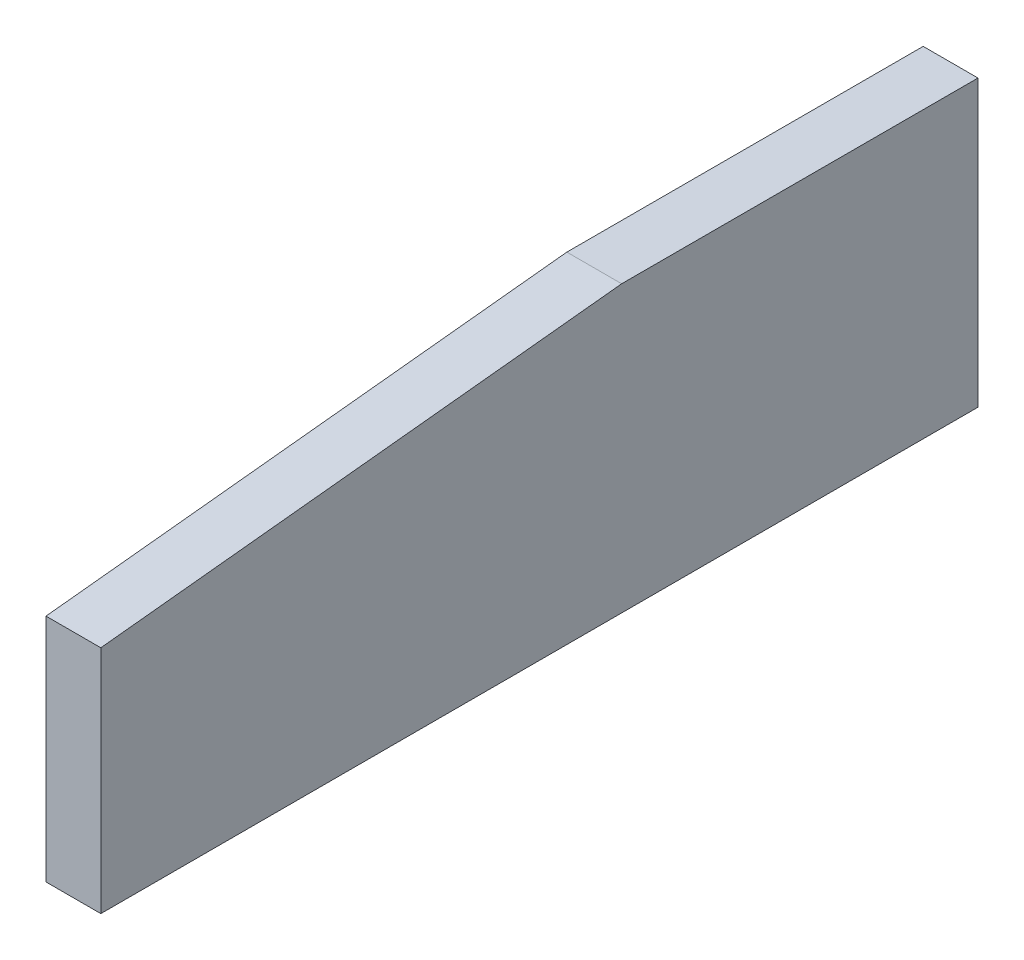
ISO-10303-21;
HEADER;
FILE_DESCRIPTION(('STEP AP214'),'2;1');
FILE_NAME('part.step','',(''),(''),'','','');
FILE_SCHEMA(('AUTOMOTIVE_DESIGN { 1 0 10303 214 1 1 1 1 }'));
ENDSEC;
DATA;
#1=APPLICATION_CONTEXT('core data for automotive mechanical design processes');
#2=APPLICATION_PROTOCOL_DEFINITION('international standard','automotive_design',2000,#1);
#3=PRODUCT_CONTEXT('',#1,'mechanical');
#4=PRODUCT('Part','Part','',(#3));
#5=PRODUCT_RELATED_PRODUCT_CATEGORY('part','',(#4));
#6=PRODUCT_DEFINITION_FORMATION('','',#4);
#7=PRODUCT_DEFINITION_CONTEXT('part definition',#1,'design');
#8=PRODUCT_DEFINITION('design','',#6,#7);
#9=PRODUCT_DEFINITION_SHAPE('','',#8);
#10=(LENGTH_UNIT() NAMED_UNIT(*) SI_UNIT(.MILLI.,.METRE.));
#11=(NAMED_UNIT(*) PLANE_ANGLE_UNIT() SI_UNIT($,.RADIAN.));
#12=(NAMED_UNIT(*) SI_UNIT($,.STERADIAN.) SOLID_ANGLE_UNIT());
#13=UNCERTAINTY_MEASURE_WITH_UNIT(LENGTH_MEASURE(1.E-05),#10,'distance_accuracy_value','');
#14=(GEOMETRIC_REPRESENTATION_CONTEXT(3) GLOBAL_UNCERTAINTY_ASSIGNED_CONTEXT((#13)) GLOBAL_UNIT_ASSIGNED_CONTEXT((#10,
#11,#12)) REPRESENTATION_CONTEXT('',''));
#15=CARTESIAN_POINT('',(0.,0.,0.));
#16=DIRECTION('',(0.,0.,1.));
#17=DIRECTION('',(1.,0.,0.));
#18=AXIS2_PLACEMENT_3D('',#15,#16,#17);
#19=CARTESIAN_POINT('',(10.,35.1320754716981,11.3396226415094));
#20=DIRECTION('',(0.,-0.994505452921406,-0.104684784518043));
#21=DIRECTION('',(0.,0.104684784518043,-0.994505452921406));
#22=AXIS2_PLACEMENT_3D('',#19,#20,#21);
#23=PLANE('',#22);
#24=DIRECTION('',(0.,-0.104684784518043,0.994505452921406));
#25=VECTOR('',#24,1.);
#26=CARTESIAN_POINT('',(0.,35.1320754716981,11.3396226415094));
#27=LINE('',#26,#25);
#28=CARTESIAN_POINT('',(0.,35.1320754716981,11.3396226415094));
#29=VERTEX_POINT('',#28);
#30=CARTESIAN_POINT('',(0.,25.1320754716981,106.339622641509));
#31=VERTEX_POINT('',#30);
#32=EDGE_CURVE('E110',#29,#31,#27,.T.);
#33=ORIENTED_EDGE('',*,*,#32,.T.);
#34=DIRECTION('',(-1.,0.,0.));
#35=VECTOR('',#34,1.);
#36=CARTESIAN_POINT('',(10.,25.1320754716981,106.339622641509));
#37=LINE('',#36,#35);
#38=CARTESIAN_POINT('',(10.,25.1320754716981,106.339622641509));
#39=VERTEX_POINT('',#38);
#40=EDGE_CURVE('E11',#39,#31,#37,.T.);
#41=ORIENTED_EDGE('',*,*,#40,.F.);
#42=DIRECTION('',(0.,-0.104684784518043,0.994505452921406));
#43=VECTOR('',#42,1.);
#44=CARTESIAN_POINT('',(10.,35.1320754716981,11.3396226415094));
#45=LINE('',#44,#43);
#46=CARTESIAN_POINT('',(10.,35.1320754716981,11.3396226415094));
#47=VERTEX_POINT('',#46);
#48=EDGE_CURVE('E119',#47,#39,#45,.T.);
#49=ORIENTED_EDGE('',*,*,#48,.F.);
#50=DIRECTION('',(-1.,0.,0.));
#51=VECTOR('',#50,1.);
#52=CARTESIAN_POINT('',(10.,35.1320754716981,11.3396226415094));
#53=LINE('',#52,#51);
#54=EDGE_CURVE('E106',#47,#29,#53,.T.);
#55=ORIENTED_EDGE('',*,*,#54,.T.);
#56=EDGE_LOOP('',(#33,#41,#49,#55));
#57=FACE_BOUND('',#56,.T.);
#58=ADVANCED_FACE('F36',(#57),#23,.F.);
#59=CARTESIAN_POINT('',(10.,25.1320754716981,106.339622641509));
#60=DIRECTION('',(0.,0.,-1.));
#61=DIRECTION('',(0.,1.,0.));
#62=AXIS2_PLACEMENT_3D('',#59,#60,#61);
#63=PLANE('',#62);
#64=DIRECTION('',(0.,-1.,0.));
#65=VECTOR('',#64,1.);
#66=CARTESIAN_POINT('',(0.,25.1320754716981,106.339622641509));
#67=LINE('',#66,#65);
#68=CARTESIAN_POINT('',(0.,-16.8679245283019,106.339622641509));
#69=VERTEX_POINT('',#68);
#70=EDGE_CURVE('E113',#31,#69,#67,.T.);
#71=ORIENTED_EDGE('',*,*,#70,.T.);
#72=DIRECTION('',(-1.,0.,0.));
#73=VECTOR('',#72,1.);
#74=CARTESIAN_POINT('',(10.,-16.8679245283019,106.339622641509));
#75=LINE('',#74,#73);
#76=CARTESIAN_POINT('',(10.,-16.8679245283019,106.339622641509));
#77=VERTEX_POINT('',#76);
#78=EDGE_CURVE('E44',#77,#69,#75,.T.);
#79=ORIENTED_EDGE('',*,*,#78,.F.);
#80=DIRECTION('',(0.,-1.,0.));
#81=VECTOR('',#80,1.);
#82=CARTESIAN_POINT('',(10.,25.1320754716981,106.339622641509));
#83=LINE('',#82,#81);
#84=EDGE_CURVE('E86',#39,#77,#83,.T.);
#85=ORIENTED_EDGE('',*,*,#84,.F.);
#86=ORIENTED_EDGE('',*,*,#40,.T.);
#87=EDGE_LOOP('',(#71,#79,#85,#86));
#88=FACE_BOUND('',#87,.T.);
#89=ADVANCED_FACE('F138',(#88),#63,.F.);
#90=CARTESIAN_POINT('',(10.,-16.8679245283019,106.339622641509));
#91=DIRECTION('',(0.,1.,0.));
#92=DIRECTION('',(0.,0.,1.));
#93=AXIS2_PLACEMENT_3D('',#90,#91,#92);
#94=PLANE('',#93);
#95=DIRECTION('',(0.,0.,-1.));
#96=VECTOR('',#95,1.);
#97=CARTESIAN_POINT('',(0.,-16.8679245283019,106.339622641509));
#98=LINE('',#97,#96);
#99=CARTESIAN_POINT('',(0.,-16.8679245283019,-53.6603773584906));
#100=VERTEX_POINT('',#99);
#101=EDGE_CURVE('E101',#69,#100,#98,.T.);
#102=ORIENTED_EDGE('',*,*,#101,.T.);
#103=DIRECTION('',(-1.,0.,0.));
#104=VECTOR('',#103,1.);
#105=CARTESIAN_POINT('',(10.,-16.8679245283019,-53.6603773584906));
#106=LINE('',#105,#104);
#107=CARTESIAN_POINT('',(10.,-16.8679245283019,-53.6603773584906));
#108=VERTEX_POINT('',#107);
#109=EDGE_CURVE('E98',#108,#100,#106,.T.);
#110=ORIENTED_EDGE('',*,*,#109,.F.);
#111=DIRECTION('',(0.,0.,-1.));
#112=VECTOR('',#111,1.);
#113=CARTESIAN_POINT('',(10.,-16.8679245283019,106.339622641509));
#114=LINE('',#113,#112);
#115=EDGE_CURVE('E90',#77,#108,#114,.T.);
#116=ORIENTED_EDGE('',*,*,#115,.F.);
#117=ORIENTED_EDGE('',*,*,#78,.T.);
#118=EDGE_LOOP('',(#102,#110,#116,#117));
#119=FACE_BOUND('',#118,.T.);
#120=ADVANCED_FACE('F99',(#119),#94,.F.);
#121=CARTESIAN_POINT('',(10.,-16.8679245283019,-53.6603773584906));
#122=DIRECTION('',(0.,0.,1.));
#123=DIRECTION('',(1.,0.,0.));
#124=AXIS2_PLACEMENT_3D('',#121,#122,#123);
#125=PLANE('',#124);
#126=DIRECTION('',(0.,1.,0.));
#127=VECTOR('',#126,1.);
#128=CARTESIAN_POINT('',(0.,-16.8679245283019,-53.6603773584906));
#129=LINE('',#128,#127);
#130=CARTESIAN_POINT('',(0.,35.1320754716981,-53.6603773584906));
#131=VERTEX_POINT('',#130);
#132=EDGE_CURVE('E72',#100,#131,#129,.T.);
#133=ORIENTED_EDGE('',*,*,#132,.T.);
#134=DIRECTION('',(-1.,0.,0.));
#135=VECTOR('',#134,1.);
#136=CARTESIAN_POINT('',(10.,35.1320754716981,-53.6603773584906));
#137=LINE('',#136,#135);
#138=CARTESIAN_POINT('',(10.,35.1320754716981,-53.6603773584906));
#139=VERTEX_POINT('',#138);
#140=EDGE_CURVE('E102',#139,#131,#137,.T.);
#141=ORIENTED_EDGE('',*,*,#140,.F.);
#142=DIRECTION('',(0.,1.,0.));
#143=VECTOR('',#142,1.);
#144=CARTESIAN_POINT('',(10.,-16.8679245283019,-53.6603773584906));
#145=LINE('',#144,#143);
#146=EDGE_CURVE('E94',#108,#139,#145,.T.);
#147=ORIENTED_EDGE('',*,*,#146,.F.);
#148=ORIENTED_EDGE('',*,*,#109,.T.);
#149=EDGE_LOOP('',(#133,#141,#147,#148));
#150=FACE_BOUND('',#149,.T.);
#151=ADVANCED_FACE('F104',(#150),#125,.F.);
#152=CARTESIAN_POINT('',(10.,35.1320754716981,-53.6603773584906));
#153=DIRECTION('',(0.,-1.,0.));
#154=DIRECTION('',(0.,0.,-1.));
#155=AXIS2_PLACEMENT_3D('',#152,#153,#154);
#156=PLANE('',#155);
#157=DIRECTION('',(0.,0.,1.));
#158=VECTOR('',#157,1.);
#159=CARTESIAN_POINT('',(0.,35.1320754716981,-53.6603773584906));
#160=LINE('',#159,#158);
#161=EDGE_CURVE('E78',#131,#29,#160,.T.);
#162=ORIENTED_EDGE('',*,*,#161,.T.);
#163=ORIENTED_EDGE('',*,*,#54,.F.);
#164=DIRECTION('',(0.,0.,1.));
#165=VECTOR('',#164,1.);
#166=CARTESIAN_POINT('',(10.,35.1320754716981,-53.6603773584906));
#167=LINE('',#166,#165);
#168=EDGE_CURVE('E52',#139,#47,#167,.T.);
#169=ORIENTED_EDGE('',*,*,#168,.F.);
#170=ORIENTED_EDGE('',*,*,#140,.T.);
#171=EDGE_LOOP('',(#162,#163,#169,#170));
#172=FACE_BOUND('',#171,.T.);
#173=ADVANCED_FACE('F127',(#172),#156,.F.);
#174=CARTESIAN_POINT('',(10.,0.,0.));
#175=DIRECTION('',(1.,0.,0.));
#176=DIRECTION('',(0.,0.,-1.));
#177=AXIS2_PLACEMENT_3D('',#174,#175,#176);
#178=PLANE('',#177);
#179=ORIENTED_EDGE('',*,*,#48,.T.);
#180=ORIENTED_EDGE('',*,*,#84,.T.);
#181=ORIENTED_EDGE('',*,*,#115,.T.);
#182=ORIENTED_EDGE('',*,*,#146,.T.);
#183=ORIENTED_EDGE('',*,*,#168,.T.);
#184=EDGE_LOOP('',(#179,#180,#181,#182,#183));
#185=FACE_BOUND('',#184,.T.);
#186=ADVANCED_FACE('F92',(#185),#178,.T.);
#187=CARTESIAN_POINT('',(0.,0.,0.));
#188=DIRECTION('',(1.,0.,0.));
#189=DIRECTION('',(0.,0.,-1.));
#190=AXIS2_PLACEMENT_3D('',#187,#188,#189);
#191=PLANE('',#190);
#192=CARTESIAN_POINT('',(0.,20.1320754716981,101.339622641509));
#193=DIRECTION('',(-1.,0.,0.));
#194=DIRECTION('',(0.,0.,1.));
#195=AXIS2_PLACEMENT_3D('',#192,#193,#194);
#196=CIRCLE('',#195,2.);
#197=CARTESIAN_POINT('',(0.,20.1320754716981,103.339622641509));
#198=VERTEX_POINT('',#197);
#199=EDGE_CURVE('E258',#198,#198,#196,.T.);
#200=ORIENTED_EDGE('',*,*,#199,.F.);
#201=EDGE_LOOP('',(#200));
#202=FACE_BOUND('',#201,.T.);
#203=CARTESIAN_POINT('',(0.,-7.86792452830189,-48.6603773584906));
#204=DIRECTION('',(-1.,0.,0.));
#205=DIRECTION('',(0.,0.,1.));
#206=AXIS2_PLACEMENT_3D('',#203,#204,#205);
#207=CIRCLE('',#206,2.);
#208=CARTESIAN_POINT('',(0.,-7.86792452830189,-46.6603773584906));
#209=VERTEX_POINT('',#208);
#210=EDGE_CURVE('E271',#209,#209,#207,.T.);
#211=ORIENTED_EDGE('',*,*,#210,.F.);
#212=EDGE_LOOP('',(#211));
#213=FACE_BOUND('',#212,.T.);
#214=CARTESIAN_POINT('',(0.,20.1320754716981,-48.6603773584906));
#215=DIRECTION('',(-1.,0.,0.));
#216=DIRECTION('',(0.,0.,1.));
#217=AXIS2_PLACEMENT_3D('',#214,#215,#216);
#218=CIRCLE('',#217,2.);
#219=CARTESIAN_POINT('',(0.,20.1320754716981,-46.6603773584906));
#220=VERTEX_POINT('',#219);
#221=EDGE_CURVE('E266',#220,#220,#218,.T.);
#222=ORIENTED_EDGE('',*,*,#221,.F.);
#223=EDGE_LOOP('',(#222));
#224=FACE_BOUND('',#223,.T.);
#225=CARTESIAN_POINT('',(0.,-7.86792452830189,101.339622641509));
#226=DIRECTION('',(-1.,0.,0.));
#227=DIRECTION('',(0.,0.,1.));
#228=AXIS2_PLACEMENT_3D('',#225,#226,#227);
#229=CIRCLE('',#228,2.);
#230=CARTESIAN_POINT('',(0.,-7.86792452830189,103.339622641509));
#231=VERTEX_POINT('',#230);
#232=EDGE_CURVE('E257',#231,#231,#229,.T.);
#233=ORIENTED_EDGE('',*,*,#232,.F.);
#234=EDGE_LOOP('',(#233));
#235=FACE_BOUND('',#234,.T.);
#236=ORIENTED_EDGE('',*,*,#32,.F.);
#237=ORIENTED_EDGE('',*,*,#161,.F.);
#238=ORIENTED_EDGE('',*,*,#132,.F.);
#239=ORIENTED_EDGE('',*,*,#101,.F.);
#240=ORIENTED_EDGE('',*,*,#70,.F.);
#241=EDGE_LOOP('',(#236,#237,#238,#239,#240));
#242=FACE_BOUND('',#241,.T.);
#243=ADVANCED_FACE('F123',(#202,#213,#224,#235,#242),#191,.F.);
#244=CARTESIAN_POINT('',(5.,-7.86792452830189,101.339622641509));
#245=DIRECTION('',(-1.,0.,0.));
#246=DIRECTION('',(0.,0.,1.));
#247=AXIS2_PLACEMENT_3D('',#244,#245,#246);
#248=CYLINDRICAL_SURFACE('',#247,2.);
#249=CARTESIAN_POINT('',(5.,-7.86792452830189,101.339622641509));
#250=DIRECTION('',(-1.,0.,0.));
#251=DIRECTION('',(0.,0.,1.));
#252=AXIS2_PLACEMENT_3D('',#249,#250,#251);
#253=CIRCLE('',#252,2.);
#254=CARTESIAN_POINT('',(5.,-7.86792452830189,103.339622641509));
#255=VERTEX_POINT('',#254);
#256=EDGE_CURVE('E114',#255,#255,#253,.T.);
#257=ORIENTED_EDGE('',*,*,#256,.F.);
#258=EDGE_LOOP('',(#257));
#259=FACE_BOUND('',#258,.T.);
#260=ORIENTED_EDGE('',*,*,#232,.T.);
#261=EDGE_LOOP('',(#260));
#262=FACE_BOUND('',#261,.T.);
#263=ADVANCED_FACE('F171',(#259,#262),#248,.F.);
#264=CARTESIAN_POINT('',(5.,-7.86792452830189,101.339622641509));
#265=DIRECTION('',(-1.,0.,0.));
#266=DIRECTION('',(0.,0.,1.));
#267=AXIS2_PLACEMENT_3D('',#264,#265,#266);
#268=PLANE('',#267);
#269=ORIENTED_EDGE('',*,*,#256,.T.);
#270=EDGE_LOOP('',(#269));
#271=FACE_BOUND('',#270,.T.);
#272=ADVANCED_FACE('F180',(#271),#268,.T.);
#273=CARTESIAN_POINT('',(5.,20.1320754716981,-48.6603773584906));
#274=DIRECTION('',(-1.,0.,0.));
#275=DIRECTION('',(0.,0.,1.));
#276=AXIS2_PLACEMENT_3D('',#273,#274,#275);
#277=CYLINDRICAL_SURFACE('',#276,2.);
#278=CARTESIAN_POINT('',(5.,20.1320754716981,-48.6603773584906));
#279=DIRECTION('',(-1.,0.,0.));
#280=DIRECTION('',(0.,0.,1.));
#281=AXIS2_PLACEMENT_3D('',#278,#279,#280);
#282=CIRCLE('',#281,2.);
#283=CARTESIAN_POINT('',(5.,20.1320754716981,-46.6603773584906));
#284=VERTEX_POINT('',#283);
#285=EDGE_CURVE('E274',#284,#284,#282,.T.);
#286=ORIENTED_EDGE('',*,*,#285,.F.);
#287=EDGE_LOOP('',(#286));
#288=FACE_BOUND('',#287,.T.);
#289=ORIENTED_EDGE('',*,*,#221,.T.);
#290=EDGE_LOOP('',(#289));
#291=FACE_BOUND('',#290,.T.);
#292=ADVANCED_FACE('F190',(#288,#291),#277,.F.);
#293=CARTESIAN_POINT('',(5.,20.1320754716981,-48.6603773584906));
#294=DIRECTION('',(-1.,0.,0.));
#295=DIRECTION('',(0.,0.,1.));
#296=AXIS2_PLACEMENT_3D('',#293,#294,#295);
#297=PLANE('',#296);
#298=ORIENTED_EDGE('',*,*,#285,.T.);
#299=EDGE_LOOP('',(#298));
#300=FACE_BOUND('',#299,.T.);
#301=ADVANCED_FACE('F200',(#300),#297,.T.);
#302=CARTESIAN_POINT('',(5.,-7.86792452830189,-48.6603773584906));
#303=DIRECTION('',(-1.,0.,0.));
#304=DIRECTION('',(0.,0.,1.));
#305=AXIS2_PLACEMENT_3D('',#302,#303,#304);
#306=CYLINDRICAL_SURFACE('',#305,2.);
#307=CARTESIAN_POINT('',(5.,-7.86792452830189,-48.6603773584906));
#308=DIRECTION('',(-1.,0.,0.));
#309=DIRECTION('',(0.,0.,1.));
#310=AXIS2_PLACEMENT_3D('',#307,#308,#309);
#311=CIRCLE('',#310,2.);
#312=CARTESIAN_POINT('',(5.,-7.86792452830189,-46.6603773584906));
#313=VERTEX_POINT('',#312);
#314=EDGE_CURVE('E263',#313,#313,#311,.T.);
#315=ORIENTED_EDGE('',*,*,#314,.F.);
#316=EDGE_LOOP('',(#315));
#317=FACE_BOUND('',#316,.T.);
#318=ORIENTED_EDGE('',*,*,#210,.T.);
#319=EDGE_LOOP('',(#318));
#320=FACE_BOUND('',#319,.T.);
#321=ADVANCED_FACE('F210',(#317,#320),#306,.F.);
#322=CARTESIAN_POINT('',(5.,-7.86792452830189,-48.6603773584906));
#323=DIRECTION('',(-1.,0.,0.));
#324=DIRECTION('',(0.,0.,1.));
#325=AXIS2_PLACEMENT_3D('',#322,#323,#324);
#326=PLANE('',#325);
#327=ORIENTED_EDGE('',*,*,#314,.T.);
#328=EDGE_LOOP('',(#327));
#329=FACE_BOUND('',#328,.T.);
#330=ADVANCED_FACE('F220',(#329),#326,.T.);
#331=CARTESIAN_POINT('',(5.,20.1320754716981,101.339622641509));
#332=DIRECTION('',(-1.,0.,0.));
#333=DIRECTION('',(0.,0.,1.));
#334=AXIS2_PLACEMENT_3D('',#331,#332,#333);
#335=CYLINDRICAL_SURFACE('',#334,2.);
#336=CARTESIAN_POINT('',(5.,20.1320754716981,101.339622641509));
#337=DIRECTION('',(-1.,0.,0.));
#338=DIRECTION('',(0.,0.,1.));
#339=AXIS2_PLACEMENT_3D('',#336,#337,#338);
#340=CIRCLE('',#339,2.);
#341=CARTESIAN_POINT('',(5.,20.1320754716981,103.339622641509));
#342=VERTEX_POINT('',#341);
#343=EDGE_CURVE('E256',#342,#342,#340,.T.);
#344=ORIENTED_EDGE('',*,*,#343,.F.);
#345=EDGE_LOOP('',(#344));
#346=FACE_BOUND('',#345,.T.);
#347=ORIENTED_EDGE('',*,*,#199,.T.);
#348=EDGE_LOOP('',(#347));
#349=FACE_BOUND('',#348,.T.);
#350=ADVANCED_FACE('F230',(#346,#349),#335,.F.);
#351=CARTESIAN_POINT('',(5.,20.1320754716981,101.339622641509));
#352=DIRECTION('',(-1.,0.,0.));
#353=DIRECTION('',(0.,0.,1.));
#354=AXIS2_PLACEMENT_3D('',#351,#352,#353);
#355=PLANE('',#354);
#356=ORIENTED_EDGE('',*,*,#343,.T.);
#357=EDGE_LOOP('',(#356));
#358=FACE_BOUND('',#357,.T.);
#359=ADVANCED_FACE('F240',(#358),#355,.T.);
#360=CLOSED_SHELL('',(#58,#89,#120,#151,#173,#186,#243,#263,#272,#292,#301,#321,#330,#350,#359));
#361=MANIFOLD_SOLID_BREP('B2',#360);
#362=ADVANCED_BREP_SHAPE_REPRESENTATION('',(#18,#361),#14);
#363=SHAPE_DEFINITION_REPRESENTATION(#9,#362);
ENDSEC;
END-ISO-10303-21;
